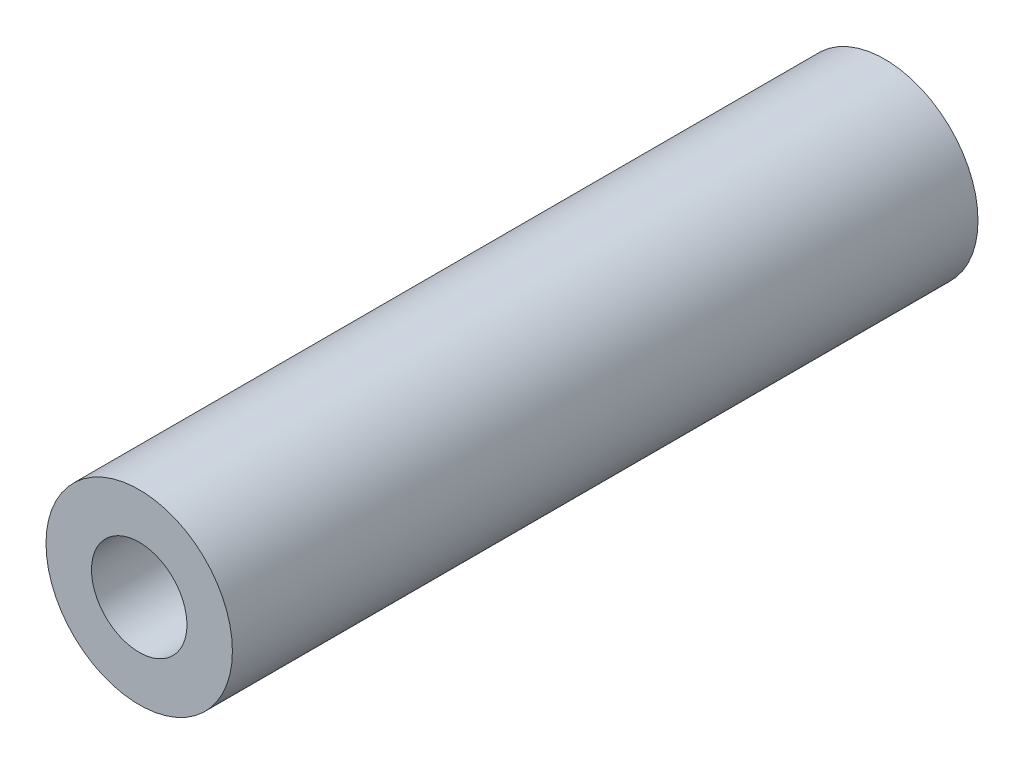
ISO-10303-21;
HEADER;
FILE_DESCRIPTION(('STEP AP214'),'2;1');
FILE_NAME('part.step','',(''),(''),'','','');
FILE_SCHEMA(('AUTOMOTIVE_DESIGN { 1 0 10303 214 1 1 1 1 }'));
ENDSEC;
DATA;
#1=APPLICATION_CONTEXT('core data for automotive mechanical design processes');
#2=APPLICATION_PROTOCOL_DEFINITION('international standard','automotive_design',2000,#1);
#3=PRODUCT_CONTEXT('',#1,'mechanical');
#4=PRODUCT('Part','Part','',(#3));
#5=PRODUCT_RELATED_PRODUCT_CATEGORY('part','',(#4));
#6=PRODUCT_DEFINITION_FORMATION('','',#4);
#7=PRODUCT_DEFINITION_CONTEXT('part definition',#1,'design');
#8=PRODUCT_DEFINITION('design','',#6,#7);
#9=PRODUCT_DEFINITION_SHAPE('','',#8);
#10=(LENGTH_UNIT() NAMED_UNIT(*) SI_UNIT(.MILLI.,.METRE.));
#11=(NAMED_UNIT(*) PLANE_ANGLE_UNIT() SI_UNIT($,.RADIAN.));
#12=(NAMED_UNIT(*) SI_UNIT($,.STERADIAN.) SOLID_ANGLE_UNIT());
#13=UNCERTAINTY_MEASURE_WITH_UNIT(LENGTH_MEASURE(1.E-05),#10,'distance_accuracy_value','');
#14=(GEOMETRIC_REPRESENTATION_CONTEXT(3) GLOBAL_UNCERTAINTY_ASSIGNED_CONTEXT((#13)) GLOBAL_UNIT_ASSIGNED_CONTEXT((#10,
#11,#12)) REPRESENTATION_CONTEXT('',''));
#15=CARTESIAN_POINT('',(0.,0.,0.));
#16=DIRECTION('',(0.,0.,1.));
#17=DIRECTION('',(1.,0.,0.));
#18=AXIS2_PLACEMENT_3D('',#15,#16,#17);
#19=CARTESIAN_POINT('',(0.,0.,19.05));
#20=DIRECTION('',(0.,0.,-1.));
#21=DIRECTION('',(-1.,0.,0.));
#22=AXIS2_PLACEMENT_3D('',#19,#20,#21);
#23=CYLINDRICAL_SURFACE('',#22,2.4384);
#24=CARTESIAN_POINT('',(0.,0.,-19.05));
#25=DIRECTION('',(0.,0.,-1.));
#26=DIRECTION('',(-1.,0.,0.));
#27=AXIS2_PLACEMENT_3D('',#24,#25,#26);
#28=CIRCLE('',#27,2.4384);
#29=CARTESIAN_POINT('',(-2.4384,0.,-19.05));
#30=VERTEX_POINT('',#29);
#31=EDGE_CURVE('E27',#30,#30,#28,.T.);
#32=ORIENTED_EDGE('',*,*,#31,.T.);
#33=EDGE_LOOP('',(#32));
#34=FACE_BOUND('',#33,.T.);
#35=CARTESIAN_POINT('',(0.,0.,19.05));
#36=DIRECTION('',(0.,0.,-1.));
#37=DIRECTION('',(-1.,0.,0.));
#38=AXIS2_PLACEMENT_3D('',#35,#36,#37);
#39=CIRCLE('',#38,2.4384);
#40=CARTESIAN_POINT('',(-2.4384,0.,19.05));
#41=VERTEX_POINT('',#40);
#42=EDGE_CURVE('E36',#41,#41,#39,.T.);
#43=ORIENTED_EDGE('',*,*,#42,.F.);
#44=EDGE_LOOP('',(#43));
#45=FACE_BOUND('',#44,.T.);
#46=ADVANCED_FACE('F15',(#34,#45),#23,.F.);
#47=CARTESIAN_POINT('',(0.,0.,19.05));
#48=DIRECTION('',(0.,0.,1.));
#49=DIRECTION('',(1.,0.,0.));
#50=AXIS2_PLACEMENT_3D('',#47,#48,#49);
#51=PLANE('',#50);
#52=ORIENTED_EDGE('',*,*,#42,.T.);
#53=EDGE_LOOP('',(#52));
#54=FACE_BOUND('',#53,.T.);
#55=CARTESIAN_POINT('',(0.,0.,19.05));
#56=DIRECTION('',(0.,0.,-1.));
#57=DIRECTION('',(-1.,0.,0.));
#58=AXIS2_PLACEMENT_3D('',#55,#56,#57);
#59=CIRCLE('',#58,4.7625);
#60=CARTESIAN_POINT('',(-4.7625,0.,19.05));
#61=VERTEX_POINT('',#60);
#62=EDGE_CURVE('E22',#61,#61,#59,.T.);
#63=ORIENTED_EDGE('',*,*,#62,.F.);
#64=EDGE_LOOP('',(#63));
#65=FACE_BOUND('',#64,.T.);
#66=ADVANCED_FACE('F41',(#54,#65),#51,.T.);
#67=CARTESIAN_POINT('',(0.,0.,-19.05));
#68=DIRECTION('',(0.,0.,1.));
#69=DIRECTION('',(1.,0.,0.));
#70=AXIS2_PLACEMENT_3D('',#67,#68,#69);
#71=PLANE('',#70);
#72=ORIENTED_EDGE('',*,*,#31,.F.);
#73=EDGE_LOOP('',(#72));
#74=FACE_BOUND('',#73,.T.);
#75=CARTESIAN_POINT('',(0.,0.,-19.05));
#76=DIRECTION('',(0.,0.,-1.));
#77=DIRECTION('',(-1.,0.,0.));
#78=AXIS2_PLACEMENT_3D('',#75,#76,#77);
#79=CIRCLE('',#78,4.7625);
#80=CARTESIAN_POINT('',(-4.7625,0.,-19.05));
#81=VERTEX_POINT('',#80);
#82=EDGE_CURVE('E10',#81,#81,#79,.F.);
#83=ORIENTED_EDGE('',*,*,#82,.F.);
#84=EDGE_LOOP('',(#83));
#85=FACE_BOUND('',#84,.T.);
#86=ADVANCED_FACE('F50',(#74,#85),#71,.F.);
#87=CARTESIAN_POINT('',(0.,0.,19.05));
#88=DIRECTION('',(0.,0.,-1.));
#89=DIRECTION('',(-1.,0.,0.));
#90=AXIS2_PLACEMENT_3D('',#87,#88,#89);
#91=CYLINDRICAL_SURFACE('',#90,4.7625);
#92=ORIENTED_EDGE('',*,*,#82,.T.);
#93=EDGE_LOOP('',(#92));
#94=FACE_BOUND('',#93,.T.);
#95=ORIENTED_EDGE('',*,*,#62,.T.);
#96=EDGE_LOOP('',(#95));
#97=FACE_BOUND('',#96,.T.);
#98=ADVANCED_FACE('F51',(#94,#97),#91,.T.);
#99=CLOSED_SHELL('',(#46,#66,#86,#98));
#100=MANIFOLD_SOLID_BREP('B1',#99);
#101=ADVANCED_BREP_SHAPE_REPRESENTATION('',(#18,#100),#14);
#102=SHAPE_DEFINITION_REPRESENTATION(#9,#101);
ENDSEC;
END-ISO-10303-21;
